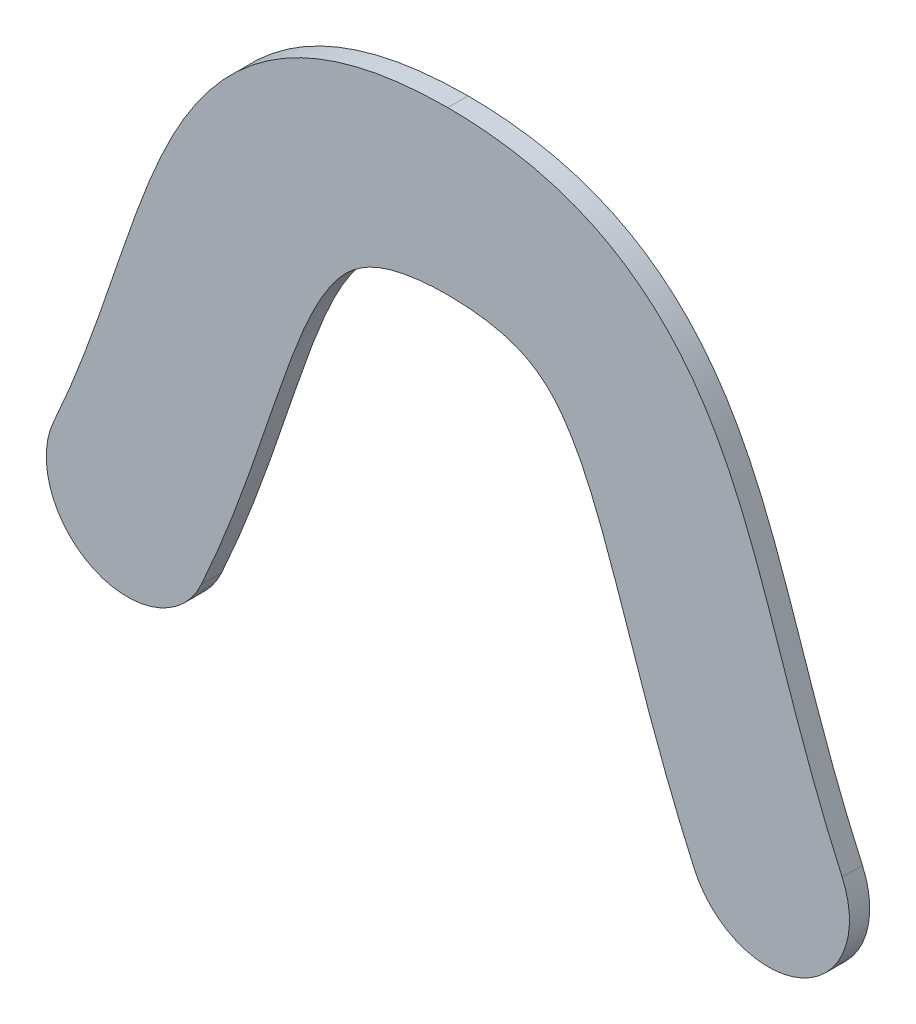
ISO-10303-21;
HEADER;
FILE_DESCRIPTION(('STEP AP214'),'2;1');
FILE_NAME('part.step','',(''),(''),'','','');
FILE_SCHEMA(('AUTOMOTIVE_DESIGN { 1 0 10303 214 1 1 1 1 }'));
ENDSEC;
DATA;
#1=APPLICATION_CONTEXT('core data for automotive mechanical design processes');
#2=APPLICATION_PROTOCOL_DEFINITION('international standard','automotive_design',2000,#1);
#3=PRODUCT_CONTEXT('',#1,'mechanical');
#4=PRODUCT('Part','Part','',(#3));
#5=PRODUCT_RELATED_PRODUCT_CATEGORY('part','',(#4));
#6=PRODUCT_DEFINITION_FORMATION('','',#4);
#7=PRODUCT_DEFINITION_CONTEXT('part definition',#1,'design');
#8=PRODUCT_DEFINITION('design','',#6,#7);
#9=PRODUCT_DEFINITION_SHAPE('','',#8);
#10=(LENGTH_UNIT() NAMED_UNIT(*) SI_UNIT(.MILLI.,.METRE.));
#11=(NAMED_UNIT(*) PLANE_ANGLE_UNIT() SI_UNIT($,.RADIAN.));
#12=(NAMED_UNIT(*) SI_UNIT($,.STERADIAN.) SOLID_ANGLE_UNIT());
#13=UNCERTAINTY_MEASURE_WITH_UNIT(LENGTH_MEASURE(1.E-05),#10,'distance_accuracy_value','');
#14=(GEOMETRIC_REPRESENTATION_CONTEXT(3) GLOBAL_UNCERTAINTY_ASSIGNED_CONTEXT((#13)) GLOBAL_UNIT_ASSIGNED_CONTEXT((#10,
#11,#12)) REPRESENTATION_CONTEXT('',''));
#15=CARTESIAN_POINT('',(0.,0.,0.));
#16=DIRECTION('',(0.,0.,1.));
#17=DIRECTION('',(1.,0.,0.));
#18=AXIS2_PLACEMENT_3D('',#15,#16,#17);
#19=CARTESIAN_POINT('',(0.,36.8095736801295,2.));
#20=CARTESIAN_POINT('',(-0.82400813591756,36.8055867732193,2.));
#21=CARTESIAN_POINT('',(-2.49039759449405,36.7573527043681,2.));
#22=CARTESIAN_POINT('',(-5.66738769064695,36.4809309515831,2.));
#23=CARTESIAN_POINT('',(-9.44412667212572,35.7887099435515,2.));
#24=CARTESIAN_POINT('',(-13.6375596943715,34.3527033205587,2.));
#25=CARTESIAN_POINT('',(-17.4255516834693,32.303545323361,2.));
#26=CARTESIAN_POINT('',(-20.7053842675276,29.7243544716556,2.));
#27=CARTESIAN_POINT('',(-24.3466186402711,25.7791245471438,2.));
#28=CARTESIAN_POINT('',(-27.6445867846001,20.2986551716413,2.));
#29=CARTESIAN_POINT('',(-30.4852729146709,13.3623565429631,2.));
#30=CARTESIAN_POINT('',(-32.5415969251717,7.29474409327879,2.));
#31=CARTESIAN_POINT('',(-34.2559924130162,2.27360154040849,2.));
#32=CARTESIAN_POINT('',(-35.6303570384767,-1.57026129684164,2.));
#33=CARTESIAN_POINT('',(-36.8944636857666,-4.83692838810419,2.));
#34=CARTESIAN_POINT('',(-37.9987932054582,-7.47788995444141,2.));
#35=CARTESIAN_POINT('',(-38.5917105567873,-8.81933061982721,2.));
#36=CARTESIAN_POINT('',(-38.8937050063958,-9.48265972740882,2.));
#37=B_SPLINE_CURVE_WITH_KNOTS('',3,(#19,#20,#21,#22,#23,#24,#25,#26,#27,#28,#29,#30,#31,#32,#33,
#34,#35,#36),.UNSPECIFIED.,.F.,.F.,(4,1,1,1,1,1,1,1,1,1,1,1,1,1,1,4),(-0.000572111886228064,
0.0306957666102166,0.0619636451066612,0.12449940209955,0.18703515909244,0.249570916085329,
0.312106673078218,0.374642430071107,0.499713944056886,0.624785458042664,0.749856972028443,
0.812392729021332,0.874928486014221,0.937464243007111,0.968732121503555,1.),.UNSPECIFIED.);
#38=DIRECTION('',(0.,0.,-1.));
#39=VECTOR('',#38,1.);
#40=SURFACE_OF_LINEAR_EXTRUSION('',#37,#39);
#41=CARTESIAN_POINT('',(0.,36.8095736801295,0.));
#42=CARTESIAN_POINT('',(-0.82400813591756,36.8055867732193,0.));
#43=CARTESIAN_POINT('',(-2.49039759449405,36.7573527043681,0.));
#44=CARTESIAN_POINT('',(-5.66738769064695,36.4809309515831,0.));
#45=CARTESIAN_POINT('',(-9.44412667212572,35.7887099435515,0.));
#46=CARTESIAN_POINT('',(-13.6375596943715,34.3527033205587,0.));
#47=CARTESIAN_POINT('',(-17.4255516834693,32.303545323361,0.));
#48=CARTESIAN_POINT('',(-20.7053842675276,29.7243544716556,0.));
#49=CARTESIAN_POINT('',(-24.3466186402711,25.7791245471438,0.));
#50=CARTESIAN_POINT('',(-27.6445867846001,20.2986551716413,0.));
#51=CARTESIAN_POINT('',(-30.4852729146709,13.3623565429631,0.));
#52=CARTESIAN_POINT('',(-32.5415969251717,7.29474409327879,0.));
#53=CARTESIAN_POINT('',(-34.2559924130162,2.27360154040849,0.));
#54=CARTESIAN_POINT('',(-35.6303570384767,-1.57026129684164,0.));
#55=CARTESIAN_POINT('',(-36.8944636857666,-4.83692838810419,0.));
#56=CARTESIAN_POINT('',(-37.9987932054582,-7.47788995444141,0.));
#57=CARTESIAN_POINT('',(-38.5917105567873,-8.81933061982721,0.));
#58=CARTESIAN_POINT('',(-38.8937050063958,-9.48265972740882,0.));
#59=B_SPLINE_CURVE_WITH_KNOTS('',3,(#41,#42,#43,#44,#45,#46,#47,#48,#49,#50,#51,#52,#53,#54,#55,
#56,#57,#58),.UNSPECIFIED.,.F.,.F.,(4,1,1,1,1,1,1,1,1,1,1,1,1,1,1,4),(-0.000572111886228064,
0.0306957666102166,0.0619636451066612,0.12449940209955,0.18703515909244,0.249570916085329,
0.312106673078218,0.374642430071107,0.499713944056886,0.624785458042664,0.749856972028443,
0.812392729021332,0.874928486014221,0.937464243007111,0.968732121503555,1.),.UNSPECIFIED.);
#60=CARTESIAN_POINT('',(0.,36.8095736801295,0.));
#61=VERTEX_POINT('',#60);
#62=CARTESIAN_POINT('',(-38.8937050063958,-9.48265972740881,0.));
#63=VERTEX_POINT('',#62);
#64=EDGE_CURVE('E135',#61,#63,#59,.T.);
#65=ORIENTED_EDGE('',*,*,#64,.T.);
#66=DIRECTION('',(0.,0.,-1.));
#67=VECTOR('',#66,1.);
#68=CARTESIAN_POINT('',(-38.8937050063958,-9.48265972740881,2.));
#69=LINE('',#68,#67);
#70=CARTESIAN_POINT('',(-38.8937050063958,-9.48265972740881,2.));
#71=VERTEX_POINT('',#70);
#72=EDGE_CURVE('E11',#71,#63,#69,.T.);
#73=ORIENTED_EDGE('',*,*,#72,.F.);
#74=CARTESIAN_POINT('',(0.,36.8095736801295,2.));
#75=VERTEX_POINT('',#74);
#76=EDGE_CURVE('E166',#75,#71,#37,.T.);
#77=ORIENTED_EDGE('',*,*,#76,.F.);
#78=DIRECTION('',(0.,0.,-1.));
#79=VECTOR('',#78,1.);
#80=CARTESIAN_POINT('',(0.,36.8095736801295,2.));
#81=LINE('',#80,#79);
#82=EDGE_CURVE('E125',#75,#61,#81,.T.);
#83=ORIENTED_EDGE('',*,*,#82,.T.);
#84=EDGE_LOOP('',(#65,#73,#77,#83));
#85=FACE_BOUND('',#84,.T.);
#86=ADVANCED_FACE('F39',(#85),#40,.F.);
#87=CARTESIAN_POINT('',(-31.6127643092467,-12.7974602590544,2.));
#88=DIRECTION('',(0.,0.,-1.));
#89=DIRECTION('',(-1.,0.,0.));
#90=AXIS2_PLACEMENT_3D('',#87,#88,#89);
#91=CYLINDRICAL_SURFACE('',#90,8.);
#92=CARTESIAN_POINT('',(-31.6127643092467,-12.7974602590544,0.));
#93=DIRECTION('',(0.,0.,1.));
#94=DIRECTION('',(1.,0.,0.));
#95=AXIS2_PLACEMENT_3D('',#92,#93,#94);
#96=CIRCLE('',#95,8.);
#97=CARTESIAN_POINT('',(-24.3318236120976,-16.1122607907,0.));
#98=VERTEX_POINT('',#97);
#99=EDGE_CURVE('E198',#63,#98,#96,.T.);
#100=ORIENTED_EDGE('',*,*,#99,.T.);
#101=DIRECTION('',(0.,0.,-1.));
#102=VECTOR('',#101,1.);
#103=CARTESIAN_POINT('',(-24.3318236120976,-16.1122607907,2.));
#104=LINE('',#103,#102);
#105=CARTESIAN_POINT('',(-24.3318236120976,-16.1122607907,2.));
#106=VERTEX_POINT('',#105);
#107=EDGE_CURVE('E49',#106,#98,#104,.T.);
#108=ORIENTED_EDGE('',*,*,#107,.F.);
#109=CARTESIAN_POINT('',(-31.6127643092467,-12.7974602590544,2.));
#110=DIRECTION('',(0.,0.,1.));
#111=DIRECTION('',(1.,0.,0.));
#112=AXIS2_PLACEMENT_3D('',#109,#110,#111);
#113=CIRCLE('',#112,8.);
#114=EDGE_CURVE('E94',#71,#106,#113,.T.);
#115=ORIENTED_EDGE('',*,*,#114,.F.);
#116=ORIENTED_EDGE('',*,*,#72,.T.);
#117=EDGE_LOOP('',(#100,#108,#115,#116));
#118=FACE_BOUND('',#117,.T.);
#119=ADVANCED_FACE('F155',(#118),#91,.T.);
#120=CARTESIAN_POINT('',(-24.3318236120976,-16.1122607907,2.));
#121=CARTESIAN_POINT('',(-23.9837832326051,-15.3477920574818,2.));
#122=CARTESIAN_POINT('',(-23.2977621450413,-13.7957110054473,2.));
#123=CARTESIAN_POINT('',(-22.0406668589634,-10.7889770786739,2.));
#124=CARTESIAN_POINT('',(-20.6287751222519,-7.13872143316877,2.));
#125=CARTESIAN_POINT('',(-19.1464495203893,-2.99135032422463,2.));
#126=CARTESIAN_POINT('',(-17.3775317286761,2.19211125708092,2.));
#127=CARTESIAN_POINT('',(-15.4286216132472,7.92984251171294,2.));
#128=CARTESIAN_POINT('',(-13.1812561007657,13.3248303275944,2.));
#129=CARTESIAN_POINT('',(-10.9057369236461,16.9243578553367,2.));
#130=CARTESIAN_POINT('',(-9.07682109649582,18.5954741493266,2.));
#131=CARTESIAN_POINT('',(-7.26288217400838,19.5960842512858,2.));
#132=CARTESIAN_POINT('',(-5.79172507697664,20.1167264523753,2.));
#133=CARTESIAN_POINT('',(-4.32654031046849,20.4474255611469,2.));
#134=CARTESIAN_POINT('',(-3.06929089278312,20.641456592799,2.));
#135=CARTESIAN_POINT('',(-1.87557008184785,20.7490352578267,2.));
#136=CARTESIAN_POINT('',(-0.838543607561429,20.7970920450567,2.));
#137=CARTESIAN_POINT('',(-0.275879500412376,20.8077093217151,2.));
#138=CARTESIAN_POINT('',(0.,20.8093639794456,2.));
#139=B_SPLINE_CURVE_WITH_KNOTS('',3,(#120,#121,#122,#123,#124,#125,#126,#127,#128,#129,#130,
#131,#132,#133,#134,#135,#136,#137,#138),.UNSPECIFIED.,.F.,.F.,(4,1,1,1,1,1,1,1,1,1,1,1,1,1,1,1,
4),(0.000709725781094872,0.0319375468504357,0.0631653679197765,0.125621010058458,
0.18807665219714,0.250532294335821,0.375443578613184,0.500354862890547,0.625266147167911,
0.750177431445274,0.812633073583955,0.875088715722637,0.906316536791978,0.937544357861318,
0.968772178930659,0.98438608946533,1.),.UNSPECIFIED.);
#140=DIRECTION('',(0.,0.,-1.));
#141=VECTOR('',#140,1.);
#142=SURFACE_OF_LINEAR_EXTRUSION('',#139,#141);
#143=CARTESIAN_POINT('',(-24.3318236120976,-16.1122607907,0.));
#144=CARTESIAN_POINT('',(-23.9837832326051,-15.3477920574818,0.));
#145=CARTESIAN_POINT('',(-23.2977621450413,-13.7957110054473,0.));
#146=CARTESIAN_POINT('',(-22.0406668589634,-10.7889770786739,0.));
#147=CARTESIAN_POINT('',(-20.6287751222519,-7.13872143316877,0.));
#148=CARTESIAN_POINT('',(-19.1464495203893,-2.99135032422463,0.));
#149=CARTESIAN_POINT('',(-17.3775317286761,2.19211125708092,0.));
#150=CARTESIAN_POINT('',(-15.4286216132472,7.92984251171294,0.));
#151=CARTESIAN_POINT('',(-13.1812561007657,13.3248303275944,0.));
#152=CARTESIAN_POINT('',(-10.9057369236461,16.9243578553367,0.));
#153=CARTESIAN_POINT('',(-9.07682109649582,18.5954741493266,0.));
#154=CARTESIAN_POINT('',(-7.26288217400838,19.5960842512858,0.));
#155=CARTESIAN_POINT('',(-5.79172507697664,20.1167264523753,0.));
#156=CARTESIAN_POINT('',(-4.32654031046849,20.4474255611469,0.));
#157=CARTESIAN_POINT('',(-3.06929089278312,20.641456592799,0.));
#158=CARTESIAN_POINT('',(-1.87557008184785,20.7490352578267,0.));
#159=CARTESIAN_POINT('',(-0.838543607561429,20.7970920450567,0.));
#160=CARTESIAN_POINT('',(-0.275879500412376,20.8077093217151,0.));
#161=CARTESIAN_POINT('',(0.,20.8093639794456,0.));
#162=B_SPLINE_CURVE_WITH_KNOTS('',3,(#143,#144,#145,#146,#147,#148,#149,#150,#151,#152,#153,
#154,#155,#156,#157,#158,#159,#160,#161),.UNSPECIFIED.,.F.,.F.,(4,1,1,1,1,1,1,1,1,1,1,1,1,1,1,1,
4),(0.000709725781094872,0.0319375468504357,0.0631653679197765,0.125621010058458,
0.18807665219714,0.250532294335821,0.375443578613184,0.500354862890547,0.625266147167911,
0.750177431445274,0.812633073583955,0.875088715722637,0.906316536791978,0.937544357861318,
0.968772178930659,0.98438608946533,1.),.UNSPECIFIED.);
#163=CARTESIAN_POINT('',(0.,20.8093639794456,0.));
#164=VERTEX_POINT('',#163);
#165=EDGE_CURVE('E195',#98,#164,#162,.T.);
#166=ORIENTED_EDGE('',*,*,#165,.T.);
#167=DIRECTION('',(0.,0.,-1.));
#168=VECTOR('',#167,1.);
#169=CARTESIAN_POINT('',(0.,20.8093639794456,2.));
#170=LINE('',#169,#168);
#171=CARTESIAN_POINT('',(0.,20.8093639794456,2.));
#172=VERTEX_POINT('',#171);
#173=EDGE_CURVE('E118',#172,#164,#170,.T.);
#174=ORIENTED_EDGE('',*,*,#173,.F.);
#175=EDGE_CURVE('E107',#106,#172,#139,.T.);
#176=ORIENTED_EDGE('',*,*,#175,.F.);
#177=ORIENTED_EDGE('',*,*,#107,.T.);
#178=EDGE_LOOP('',(#166,#174,#176,#177));
#179=FACE_BOUND('',#178,.T.);
#180=ADVANCED_FACE('F153',(#179),#142,.F.);
#181=CARTESIAN_POINT('',(0.,20.8093639794456,2.));
#182=CARTESIAN_POINT('',(0.275879500412376,20.8077093217151,2.));
#183=CARTESIAN_POINT('',(0.838543607561429,20.7970920450567,2.));
#184=CARTESIAN_POINT('',(1.87557008184785,20.7490352578267,2.));
#185=CARTESIAN_POINT('',(3.06929089278312,20.641456592799,2.));
#186=CARTESIAN_POINT('',(4.32654031046849,20.4474255611469,2.));
#187=CARTESIAN_POINT('',(5.79172507697664,20.1167264523753,2.));
#188=CARTESIAN_POINT('',(7.26288217400838,19.5960842512858,2.));
#189=CARTESIAN_POINT('',(9.07682109649582,18.5954741493266,2.));
#190=CARTESIAN_POINT('',(10.9057369236461,16.9243578553367,2.));
#191=CARTESIAN_POINT('',(13.1812561007657,13.3248303275944,2.));
#192=CARTESIAN_POINT('',(15.4286216132472,7.92984251171295,2.));
#193=CARTESIAN_POINT('',(17.3775317286761,2.19211125708091,2.));
#194=CARTESIAN_POINT('',(19.1464495203893,-2.99135032422463,2.));
#195=CARTESIAN_POINT('',(20.6287751222519,-7.13872143316877,2.));
#196=CARTESIAN_POINT('',(22.0406668589634,-10.7889770786739,2.));
#197=CARTESIAN_POINT('',(23.2977621450413,-13.7957110054473,2.));
#198=CARTESIAN_POINT('',(23.9837832326051,-15.3477920574818,2.));
#199=CARTESIAN_POINT('',(24.3318236120976,-16.1122607907,2.));
#200=B_SPLINE_CURVE_WITH_KNOTS('',3,(#181,#182,#183,#184,#185,#186,#187,#188,#189,#190,#191,
#192,#193,#194,#195,#196,#197,#198,#199),.UNSPECIFIED.,.F.,.F.,(4,1,1,1,1,1,1,1,1,1,1,1,1,1,1,1,
4),(0.00070972578109485,0.0163236363157653,0.0319375468504357,0.0631653679197764,
0.0943931889891172,0.125621010058458,0.18807665219714,0.250532294335821,0.375443578613184,
0.500354862890547,0.625266147167911,0.750177431445274,0.812633073583955,0.875088715722637,
0.937544357861318,0.968772178930659,1.),.UNSPECIFIED.);
#201=DIRECTION('',(0.,0.,-1.));
#202=VECTOR('',#201,1.);
#203=SURFACE_OF_LINEAR_EXTRUSION('',#200,#202);
#204=CARTESIAN_POINT('',(0.,20.8093639794456,0.));
#205=CARTESIAN_POINT('',(0.275879500412376,20.8077093217151,0.));
#206=CARTESIAN_POINT('',(0.838543607561429,20.7970920450567,0.));
#207=CARTESIAN_POINT('',(1.87557008184785,20.7490352578267,0.));
#208=CARTESIAN_POINT('',(3.06929089278312,20.641456592799,0.));
#209=CARTESIAN_POINT('',(4.32654031046849,20.4474255611469,0.));
#210=CARTESIAN_POINT('',(5.79172507697664,20.1167264523753,0.));
#211=CARTESIAN_POINT('',(7.26288217400838,19.5960842512858,0.));
#212=CARTESIAN_POINT('',(9.07682109649582,18.5954741493266,0.));
#213=CARTESIAN_POINT('',(10.9057369236461,16.9243578553367,0.));
#214=CARTESIAN_POINT('',(13.1812561007657,13.3248303275944,0.));
#215=CARTESIAN_POINT('',(15.4286216132472,7.92984251171295,0.));
#216=CARTESIAN_POINT('',(17.3775317286761,2.19211125708091,0.));
#217=CARTESIAN_POINT('',(19.1464495203893,-2.99135032422463,0.));
#218=CARTESIAN_POINT('',(20.6287751222519,-7.13872143316877,0.));
#219=CARTESIAN_POINT('',(22.0406668589634,-10.7889770786739,0.));
#220=CARTESIAN_POINT('',(23.2977621450413,-13.7957110054473,0.));
#221=CARTESIAN_POINT('',(23.9837832326051,-15.3477920574818,0.));
#222=CARTESIAN_POINT('',(24.3318236120976,-16.1122607907,0.));
#223=B_SPLINE_CURVE_WITH_KNOTS('',3,(#204,#205,#206,#207,#208,#209,#210,#211,#212,#213,#214,
#215,#216,#217,#218,#219,#220,#221,#222),.UNSPECIFIED.,.F.,.F.,(4,1,1,1,1,1,1,1,1,1,1,1,1,1,1,1,
4),(0.00070972578109485,0.0163236363157653,0.0319375468504357,0.0631653679197764,
0.0943931889891172,0.125621010058458,0.18807665219714,0.250532294335821,0.375443578613184,
0.500354862890547,0.625266147167911,0.750177431445274,0.812633073583955,0.875088715722637,
0.937544357861318,0.968772178930659,1.),.UNSPECIFIED.);
#224=CARTESIAN_POINT('',(24.3318236120976,-16.1122607907,0.));
#225=VERTEX_POINT('',#224);
#226=EDGE_CURVE('E116',#164,#225,#223,.T.);
#227=ORIENTED_EDGE('',*,*,#226,.T.);
#228=DIRECTION('',(0.,0.,-1.));
#229=VECTOR('',#228,1.);
#230=CARTESIAN_POINT('',(24.3318236120976,-16.1122607907,2.));
#231=LINE('',#230,#229);
#232=CARTESIAN_POINT('',(24.3318236120976,-16.1122607907,2.));
#233=VERTEX_POINT('',#232);
#234=EDGE_CURVE('E113',#233,#225,#231,.T.);
#235=ORIENTED_EDGE('',*,*,#234,.F.);
#236=EDGE_CURVE('E101',#172,#233,#200,.T.);
#237=ORIENTED_EDGE('',*,*,#236,.F.);
#238=ORIENTED_EDGE('',*,*,#173,.T.);
#239=EDGE_LOOP('',(#227,#235,#237,#238));
#240=FACE_BOUND('',#239,.T.);
#241=ADVANCED_FACE('F114',(#240),#203,.F.);
#242=CARTESIAN_POINT('',(31.6127643092467,-12.7974602590544,2.));
#243=DIRECTION('',(0.,0.,-1.));
#244=DIRECTION('',(-1.,0.,0.));
#245=AXIS2_PLACEMENT_3D('',#242,#243,#244);
#246=CYLINDRICAL_SURFACE('',#245,8.);
#247=CARTESIAN_POINT('',(31.6127643092467,-12.7974602590544,0.));
#248=DIRECTION('',(0.,0.,1.));
#249=DIRECTION('',(-1.,0.,0.));
#250=AXIS2_PLACEMENT_3D('',#247,#248,#249);
#251=CIRCLE('',#250,8.);
#252=CARTESIAN_POINT('',(38.8937050063958,-9.48265972740882,0.));
#253=VERTEX_POINT('',#252);
#254=EDGE_CURVE('E80',#225,#253,#251,.T.);
#255=ORIENTED_EDGE('',*,*,#254,.T.);
#256=DIRECTION('',(0.,0.,-1.));
#257=VECTOR('',#256,1.);
#258=CARTESIAN_POINT('',(38.8937050063958,-9.48265972740882,2.));
#259=LINE('',#258,#257);
#260=CARTESIAN_POINT('',(38.8937050063958,-9.48265972740882,2.));
#261=VERTEX_POINT('',#260);
#262=EDGE_CURVE('E119',#261,#253,#259,.T.);
#263=ORIENTED_EDGE('',*,*,#262,.F.);
#264=CARTESIAN_POINT('',(31.6127643092467,-12.7974602590544,2.));
#265=DIRECTION('',(0.,0.,1.));
#266=DIRECTION('',(-1.,0.,0.));
#267=AXIS2_PLACEMENT_3D('',#264,#265,#266);
#268=CIRCLE('',#267,8.);
#269=EDGE_CURVE('E105',#233,#261,#268,.T.);
#270=ORIENTED_EDGE('',*,*,#269,.F.);
#271=ORIENTED_EDGE('',*,*,#234,.T.);
#272=EDGE_LOOP('',(#255,#263,#270,#271));
#273=FACE_BOUND('',#272,.T.);
#274=ADVANCED_FACE('F121',(#273),#246,.T.);
#275=CARTESIAN_POINT('',(38.8937050063958,-9.48265972740882,2.));
#276=CARTESIAN_POINT('',(38.5917105567873,-8.81933061982722,2.));
#277=CARTESIAN_POINT('',(37.9987932054582,-7.47788995444141,2.));
#278=CARTESIAN_POINT('',(36.8944636857666,-4.83692838810419,2.));
#279=CARTESIAN_POINT('',(35.6303570384767,-1.57026129684162,2.));
#280=CARTESIAN_POINT('',(34.2559924130162,2.27360154040851,2.));
#281=CARTESIAN_POINT('',(32.5415969251716,7.29474409327883,2.));
#282=CARTESIAN_POINT('',(30.4852729146709,13.3623565429631,2.));
#283=CARTESIAN_POINT('',(27.6445867846001,20.2986551716414,2.));
#284=CARTESIAN_POINT('',(24.3466186402711,25.7791245471438,2.));
#285=CARTESIAN_POINT('',(20.7053842675275,29.7243544716557,2.));
#286=CARTESIAN_POINT('',(17.4255516834693,32.3035453233611,2.));
#287=CARTESIAN_POINT('',(13.6375596943714,34.3527033205588,2.));
#288=CARTESIAN_POINT('',(9.44412667212559,35.7887099435516,2.));
#289=CARTESIAN_POINT('',(5.66738769064684,36.4809309515831,2.));
#290=CARTESIAN_POINT('',(2.49039759449391,36.7573527043681,2.));
#291=CARTESIAN_POINT('',(0.824008135917439,36.8055867732193,2.));
#292=CARTESIAN_POINT('',(0.,36.8095736801295,2.));
#293=B_SPLINE_CURVE_WITH_KNOTS('',3,(#275,#276,#277,#278,#279,#280,#281,#282,#283,#284,#285,
#286,#287,#288,#289,#290,#291,#292),.UNSPECIFIED.,.F.,.F.,(4,1,1,1,1,1,1,1,1,1,1,1,1,1,1,4),
(-0.000572111886229743,0.0306957666102149,0.0619636451066596,0.124499402099549,
0.187035159092438,0.249570916085328,0.374642430071106,0.499713944056885,0.624785458042664,
0.687321215035553,0.749856972028443,0.812392729021332,0.874928486014221,0.937464243007111,
0.968732121503555,1.),.UNSPECIFIED.);
#294=DIRECTION('',(0.,0.,-1.));
#295=VECTOR('',#294,1.);
#296=SURFACE_OF_LINEAR_EXTRUSION('',#293,#295);
#297=CARTESIAN_POINT('',(38.8937050063958,-9.48265972740882,0.));
#298=CARTESIAN_POINT('',(38.5917105567873,-8.81933061982722,0.));
#299=CARTESIAN_POINT('',(37.9987932054582,-7.47788995444141,0.));
#300=CARTESIAN_POINT('',(36.8944636857666,-4.83692838810419,0.));
#301=CARTESIAN_POINT('',(35.6303570384767,-1.57026129684162,0.));
#302=CARTESIAN_POINT('',(34.2559924130162,2.27360154040851,0.));
#303=CARTESIAN_POINT('',(32.5415969251716,7.29474409327883,0.));
#304=CARTESIAN_POINT('',(30.4852729146709,13.3623565429631,0.));
#305=CARTESIAN_POINT('',(27.6445867846001,20.2986551716414,0.));
#306=CARTESIAN_POINT('',(24.3466186402711,25.7791245471438,0.));
#307=CARTESIAN_POINT('',(20.7053842675275,29.7243544716557,0.));
#308=CARTESIAN_POINT('',(17.4255516834693,32.3035453233611,0.));
#309=CARTESIAN_POINT('',(13.6375596943714,34.3527033205588,0.));
#310=CARTESIAN_POINT('',(9.44412667212559,35.7887099435516,0.));
#311=CARTESIAN_POINT('',(5.66738769064684,36.4809309515831,0.));
#312=CARTESIAN_POINT('',(2.49039759449391,36.7573527043681,0.));
#313=CARTESIAN_POINT('',(0.824008135917439,36.8055867732193,0.));
#314=CARTESIAN_POINT('',(0.,36.8095736801295,0.));
#315=B_SPLINE_CURVE_WITH_KNOTS('',3,(#297,#298,#299,#300,#301,#302,#303,#304,#305,#306,#307,
#308,#309,#310,#311,#312,#313,#314),.UNSPECIFIED.,.F.,.F.,(4,1,1,1,1,1,1,1,1,1,1,1,1,1,1,4),
(-0.000572111886229743,0.0306957666102149,0.0619636451066596,0.124499402099549,
0.187035159092438,0.249570916085328,0.374642430071106,0.499713944056885,0.624785458042664,
0.687321215035553,0.749856972028443,0.812392729021332,0.874928486014221,0.937464243007111,
0.968732121503555,1.),.UNSPECIFIED.);
#316=EDGE_CURVE('E86',#253,#61,#315,.T.);
#317=ORIENTED_EDGE('',*,*,#316,.T.);
#318=ORIENTED_EDGE('',*,*,#82,.F.);
#319=EDGE_CURVE('E57',#261,#75,#293,.T.);
#320=ORIENTED_EDGE('',*,*,#319,.F.);
#321=ORIENTED_EDGE('',*,*,#262,.T.);
#322=EDGE_LOOP('',(#317,#318,#320,#321));
#323=FACE_BOUND('',#322,.T.);
#324=ADVANCED_FACE('F143',(#323),#296,.F.);
#325=CARTESIAN_POINT('',(-27.4584408440794,20.2386992752955,2.));
#326=DIRECTION('',(0.,0.,-1.));
#327=DIRECTION('',(-1.,0.,0.));
#328=AXIS2_PLACEMENT_3D('',#325,#326,#327);
#329=PLANE('',#328);
#330=ORIENTED_EDGE('',*,*,#76,.T.);
#331=ORIENTED_EDGE('',*,*,#114,.T.);
#332=ORIENTED_EDGE('',*,*,#175,.T.);
#333=ORIENTED_EDGE('',*,*,#236,.T.);
#334=ORIENTED_EDGE('',*,*,#269,.T.);
#335=ORIENTED_EDGE('',*,*,#319,.T.);
#336=EDGE_LOOP('',(#330,#331,#332,#333,#334,#335));
#337=FACE_BOUND('',#336,.T.);
#338=ADVANCED_FACE('F103',(#337),#329,.F.);
#339=CARTESIAN_POINT('',(-27.4584408440794,20.2386992752955,0.));
#340=DIRECTION('',(0.,0.,-1.));
#341=DIRECTION('',(-1.,0.,0.));
#342=AXIS2_PLACEMENT_3D('',#339,#340,#341);
#343=PLANE('',#342);
#344=ORIENTED_EDGE('',*,*,#64,.F.);
#345=ORIENTED_EDGE('',*,*,#316,.F.);
#346=ORIENTED_EDGE('',*,*,#254,.F.);
#347=ORIENTED_EDGE('',*,*,#226,.F.);
#348=ORIENTED_EDGE('',*,*,#165,.F.);
#349=ORIENTED_EDGE('',*,*,#99,.F.);
#350=EDGE_LOOP('',(#344,#345,#346,#347,#348,#349));
#351=FACE_BOUND('',#350,.T.);
#352=ADVANCED_FACE('F147',(#351),#343,.T.);
#353=CLOSED_SHELL('',(#86,#119,#180,#241,#274,#324,#338,#352));
#354=MANIFOLD_SOLID_BREP('B2',#353);
#355=ADVANCED_BREP_SHAPE_REPRESENTATION('',(#18,#354),#14);
#356=SHAPE_DEFINITION_REPRESENTATION(#9,#355);
ENDSEC;
END-ISO-10303-21;
